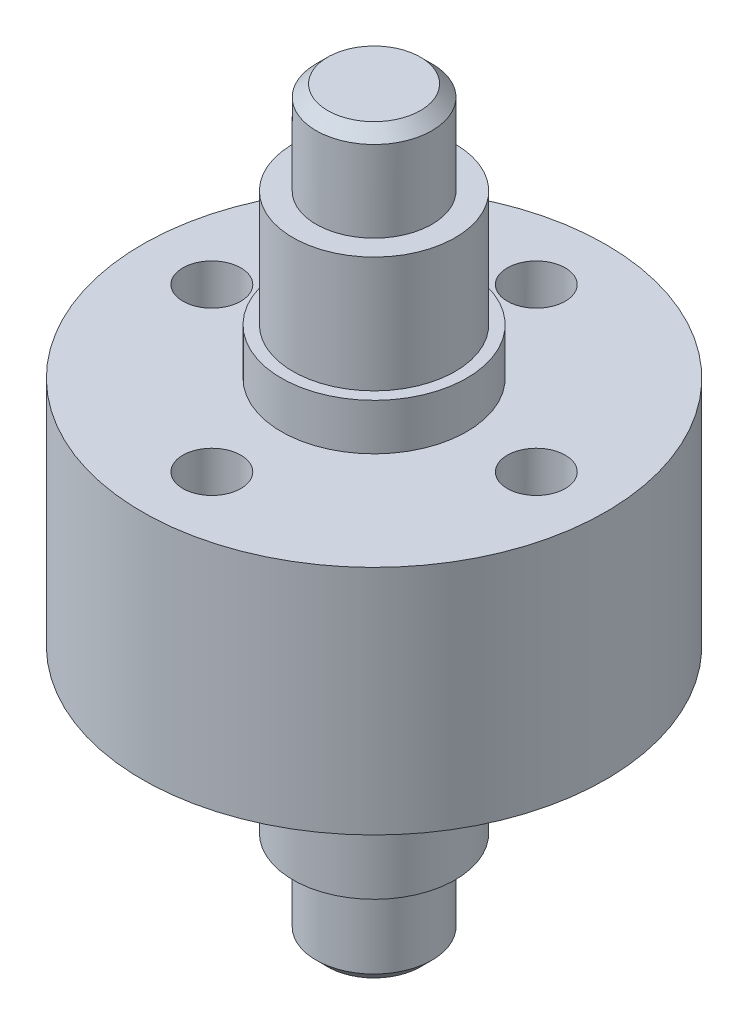
ISO-10303-21;
HEADER;
FILE_DESCRIPTION(('STEP AP214'),'2;1');
FILE_NAME('part.step','',(''),(''),'','','');
FILE_SCHEMA(('AUTOMOTIVE_DESIGN { 1 0 10303 214 1 1 1 1 }'));
ENDSEC;
DATA;
#1=APPLICATION_CONTEXT('core data for automotive mechanical design processes');
#2=APPLICATION_PROTOCOL_DEFINITION('international standard','automotive_design',2000,#1);
#3=PRODUCT_CONTEXT('',#1,'mechanical');
#4=PRODUCT('Part','Part','',(#3));
#5=PRODUCT_RELATED_PRODUCT_CATEGORY('part','',(#4));
#6=PRODUCT_DEFINITION_FORMATION('','',#4);
#7=PRODUCT_DEFINITION_CONTEXT('part definition',#1,'design');
#8=PRODUCT_DEFINITION('design','',#6,#7);
#9=PRODUCT_DEFINITION_SHAPE('','',#8);
#10=(LENGTH_UNIT() NAMED_UNIT(*) SI_UNIT(.MILLI.,.METRE.));
#11=(NAMED_UNIT(*) PLANE_ANGLE_UNIT() SI_UNIT($,.RADIAN.));
#12=(NAMED_UNIT(*) SI_UNIT($,.STERADIAN.) SOLID_ANGLE_UNIT());
#13=UNCERTAINTY_MEASURE_WITH_UNIT(LENGTH_MEASURE(1.E-05),#10,'distance_accuracy_value','');
#14=(GEOMETRIC_REPRESENTATION_CONTEXT(3) GLOBAL_UNCERTAINTY_ASSIGNED_CONTEXT((#13)) GLOBAL_UNIT_ASSIGNED_CONTEXT((#10,
#11,#12)) REPRESENTATION_CONTEXT('',''));
#15=CARTESIAN_POINT('',(0.,0.,0.));
#16=DIRECTION('',(0.,0.,1.));
#17=DIRECTION('',(1.,0.,0.));
#18=AXIS2_PLACEMENT_3D('',#15,#16,#17);
#19=CARTESIAN_POINT('',(2.5,0.,0.));
#20=DIRECTION('',(0.,-1.,0.));
#21=DIRECTION('',(0.,0.,-1.));
#22=AXIS2_PLACEMENT_3D('',#19,#20,#21);
#23=PLANE('',#22);
#24=CARTESIAN_POINT('',(0.,0.,0.));
#25=DIRECTION('',(0.,-1.,0.));
#26=DIRECTION('',(0.,0.,-1.));
#27=AXIS2_PLACEMENT_3D('',#24,#25,#26);
#28=CIRCLE('',#27,1.99999999999999);
#29=CARTESIAN_POINT('',(0.,0.,-1.99999999999999));
#30=VERTEX_POINT('',#29);
#31=EDGE_CURVE('E42',#30,#30,#28,.T.);
#32=ORIENTED_EDGE('',*,*,#31,.T.);
#33=EDGE_LOOP('',(#32));
#34=FACE_BOUND('',#33,.T.);
#35=ADVANCED_FACE('F35',(#34),#23,.T.);
#36=CARTESIAN_POINT('',(0.,32.,0.));
#37=DIRECTION('',(0.,1.,0.));
#38=DIRECTION('',(0.,0.,1.));
#39=AXIS2_PLACEMENT_3D('',#36,#37,#38);
#40=PLANE('',#39);
#41=CARTESIAN_POINT('',(0.,32.,0.));
#42=DIRECTION('',(0.,1.,0.));
#43=DIRECTION('',(0.,0.,1.));
#44=AXIS2_PLACEMENT_3D('',#41,#42,#43);
#45=CIRCLE('',#44,2.00000000000001);
#46=CARTESIAN_POINT('',(0.,32.,2.00000000000001));
#47=VERTEX_POINT('',#46);
#48=EDGE_CURVE('E46',#47,#47,#45,.T.);
#49=ORIENTED_EDGE('',*,*,#48,.T.);
#50=EDGE_LOOP('',(#49));
#51=FACE_BOUND('',#50,.T.);
#52=ADVANCED_FACE('F181',(#51),#40,.T.);
#53=CARTESIAN_POINT('',(0.,0.,0.));
#54=DIRECTION('',(0.,-1.,0.));
#55=DIRECTION('',(0.,0.,-1.));
#56=AXIS2_PLACEMENT_3D('',#53,#54,#55);
#57=CYLINDRICAL_SURFACE('',#56,2.5);
#58=CARTESIAN_POINT('',(0.,31.5,0.));
#59=DIRECTION('',(0.,1.,0.));
#60=DIRECTION('',(0.,0.,1.));
#61=AXIS2_PLACEMENT_3D('',#58,#59,#60);
#62=CIRCLE('',#61,2.5);
#63=CARTESIAN_POINT('',(0.,31.5,2.5));
#64=VERTEX_POINT('',#63);
#65=EDGE_CURVE('E50',#64,#64,#62,.F.);
#66=ORIENTED_EDGE('',*,*,#65,.T.);
#67=EDGE_LOOP('',(#66));
#68=FACE_BOUND('',#67,.T.);
#69=CARTESIAN_POINT('',(0.,28.,0.));
#70=DIRECTION('',(0.,-1.,0.));
#71=DIRECTION('',(0.,0.,-1.));
#72=AXIS2_PLACEMENT_3D('',#69,#70,#71);
#73=CIRCLE('',#72,2.5);
#74=CARTESIAN_POINT('',(0.,28.,-2.5));
#75=VERTEX_POINT('',#74);
#76=EDGE_CURVE('E55',#75,#75,#73,.T.);
#77=ORIENTED_EDGE('',*,*,#76,.F.);
#78=EDGE_LOOP('',(#77));
#79=FACE_BOUND('',#78,.T.);
#80=ADVANCED_FACE('F186',(#68,#79),#57,.T.);
#81=CARTESIAN_POINT('',(2.5,28.,0.));
#82=DIRECTION('',(0.,1.,0.));
#83=DIRECTION('',(0.,0.,1.));
#84=AXIS2_PLACEMENT_3D('',#81,#82,#83);
#85=PLANE('',#84);
#86=ORIENTED_EDGE('',*,*,#76,.T.);
#87=EDGE_LOOP('',(#86));
#88=FACE_BOUND('',#87,.T.);
#89=CARTESIAN_POINT('',(0.,28.,0.));
#90=DIRECTION('',(0.,-1.,0.));
#91=DIRECTION('',(0.,0.,-1.));
#92=AXIS2_PLACEMENT_3D('',#89,#90,#91);
#93=CIRCLE('',#92,3.5);
#94=CARTESIAN_POINT('',(0.,28.,-3.5));
#95=VERTEX_POINT('',#94);
#96=EDGE_CURVE('E63',#95,#95,#93,.T.);
#97=ORIENTED_EDGE('',*,*,#96,.F.);
#98=EDGE_LOOP('',(#97));
#99=FACE_BOUND('',#98,.T.);
#100=ADVANCED_FACE('F207',(#88,#99),#85,.T.);
#101=CARTESIAN_POINT('',(0.,0.,0.));
#102=DIRECTION('',(0.,-1.,0.));
#103=DIRECTION('',(0.,0.,-1.));
#104=AXIS2_PLACEMENT_3D('',#101,#102,#103);
#105=CYLINDRICAL_SURFACE('',#104,3.5);
#106=ORIENTED_EDGE('',*,*,#96,.T.);
#107=EDGE_LOOP('',(#106));
#108=FACE_BOUND('',#107,.T.);
#109=CARTESIAN_POINT('',(0.,23.,0.));
#110=DIRECTION('',(0.,-1.,0.));
#111=DIRECTION('',(0.,0.,-1.));
#112=AXIS2_PLACEMENT_3D('',#109,#110,#111);
#113=CIRCLE('',#112,3.5);
#114=CARTESIAN_POINT('',(0.,23.,-3.5));
#115=VERTEX_POINT('',#114);
#116=EDGE_CURVE('E66',#115,#115,#113,.T.);
#117=ORIENTED_EDGE('',*,*,#116,.F.);
#118=EDGE_LOOP('',(#117));
#119=FACE_BOUND('',#118,.T.);
#120=ADVANCED_FACE('F212',(#108,#119),#105,.T.);
#121=CARTESIAN_POINT('',(3.5,23.,0.));
#122=DIRECTION('',(0.,1.,0.));
#123=DIRECTION('',(0.,0.,1.));
#124=AXIS2_PLACEMENT_3D('',#121,#122,#123);
#125=PLANE('',#124);
#126=ORIENTED_EDGE('',*,*,#116,.T.);
#127=EDGE_LOOP('',(#126));
#128=FACE_BOUND('',#127,.T.);
#129=CARTESIAN_POINT('',(0.,23.,0.));
#130=DIRECTION('',(0.,-1.,0.));
#131=DIRECTION('',(0.,0.,-1.));
#132=AXIS2_PLACEMENT_3D('',#129,#130,#131);
#133=CIRCLE('',#132,4.);
#134=CARTESIAN_POINT('',(0.,23.,-4.));
#135=VERTEX_POINT('',#134);
#136=EDGE_CURVE('E69',#135,#135,#133,.T.);
#137=ORIENTED_EDGE('',*,*,#136,.F.);
#138=EDGE_LOOP('',(#137));
#139=FACE_BOUND('',#138,.T.);
#140=ADVANCED_FACE('F218',(#128,#139),#125,.T.);
#141=CARTESIAN_POINT('',(0.,0.,0.));
#142=DIRECTION('',(0.,-1.,0.));
#143=DIRECTION('',(0.,0.,-1.));
#144=AXIS2_PLACEMENT_3D('',#141,#142,#143);
#145=CYLINDRICAL_SURFACE('',#144,4.);
#146=ORIENTED_EDGE('',*,*,#136,.T.);
#147=EDGE_LOOP('',(#146));
#148=FACE_BOUND('',#147,.T.);
#149=CARTESIAN_POINT('',(0.,21.,0.));
#150=DIRECTION('',(0.,-1.,0.));
#151=DIRECTION('',(0.,0.,-1.));
#152=AXIS2_PLACEMENT_3D('',#149,#150,#151);
#153=CIRCLE('',#152,4.);
#154=CARTESIAN_POINT('',(0.,21.,-4.));
#155=VERTEX_POINT('',#154);
#156=EDGE_CURVE('E72',#155,#155,#153,.T.);
#157=ORIENTED_EDGE('',*,*,#156,.F.);
#158=EDGE_LOOP('',(#157));
#159=FACE_BOUND('',#158,.T.);
#160=ADVANCED_FACE('F122',(#148,#159),#145,.T.);
#161=CARTESIAN_POINT('',(4.,21.,0.));
#162=DIRECTION('',(0.,1.,0.));
#163=DIRECTION('',(0.,0.,1.));
#164=AXIS2_PLACEMENT_3D('',#161,#162,#163);
#165=PLANE('',#164);
#166=CARTESIAN_POINT('',(0.,21.,-7.));
#167=DIRECTION('',(0.,1.,0.));
#168=DIRECTION('',(0.,0.,1.));
#169=AXIS2_PLACEMENT_3D('',#166,#167,#168);
#170=CIRCLE('',#169,1.24999999999999);
#171=CARTESIAN_POINT('',(0.,21.,-5.75000000000001));
#172=VERTEX_POINT('',#171);
#173=EDGE_CURVE('E112',#172,#172,#170,.T.);
#174=ORIENTED_EDGE('',*,*,#173,.F.);
#175=EDGE_LOOP('',(#174));
#176=FACE_BOUND('',#175,.T.);
#177=CARTESIAN_POINT('',(7.,21.,0.));
#178=DIRECTION('',(0.,1.,0.));
#179=DIRECTION('',(0.,0.,1.));
#180=AXIS2_PLACEMENT_3D('',#177,#178,#179);
#181=CIRCLE('',#180,1.24999999999999);
#182=CARTESIAN_POINT('',(7.,21.,1.24999999999999));
#183=VERTEX_POINT('',#182);
#184=EDGE_CURVE('E106',#183,#183,#181,.T.);
#185=ORIENTED_EDGE('',*,*,#184,.F.);
#186=EDGE_LOOP('',(#185));
#187=FACE_BOUND('',#186,.T.);
#188=CARTESIAN_POINT('',(0.,21.,7.));
#189=DIRECTION('',(0.,1.,0.));
#190=DIRECTION('',(0.,0.,1.));
#191=AXIS2_PLACEMENT_3D('',#188,#189,#190);
#192=CIRCLE('',#191,1.24999999999999);
#193=CARTESIAN_POINT('',(0.,21.,8.24999999999999));
#194=VERTEX_POINT('',#193);
#195=EDGE_CURVE('E60',#194,#194,#192,.T.);
#196=ORIENTED_EDGE('',*,*,#195,.F.);
#197=EDGE_LOOP('',(#196));
#198=FACE_BOUND('',#197,.T.);
#199=CARTESIAN_POINT('',(-7.,21.,0.));
#200=DIRECTION('',(0.,1.,0.));
#201=DIRECTION('',(0.,0.,1.));
#202=AXIS2_PLACEMENT_3D('',#199,#200,#201);
#203=CIRCLE('',#202,1.24999999999999);
#204=CARTESIAN_POINT('',(-7.,21.,1.24999999999999));
#205=VERTEX_POINT('',#204);
#206=EDGE_CURVE('E59',#205,#205,#203,.T.);
#207=ORIENTED_EDGE('',*,*,#206,.F.);
#208=EDGE_LOOP('',(#207));
#209=FACE_BOUND('',#208,.T.);
#210=ORIENTED_EDGE('',*,*,#156,.T.);
#211=EDGE_LOOP('',(#210));
#212=FACE_BOUND('',#211,.T.);
#213=CARTESIAN_POINT('',(0.,21.,0.));
#214=DIRECTION('',(0.,-1.,0.));
#215=DIRECTION('',(0.,0.,-1.));
#216=AXIS2_PLACEMENT_3D('',#213,#214,#215);
#217=CIRCLE('',#216,10.);
#218=CARTESIAN_POINT('',(0.,21.,-10.));
#219=VERTEX_POINT('',#218);
#220=EDGE_CURVE('E75',#219,#219,#217,.T.);
#221=ORIENTED_EDGE('',*,*,#220,.F.);
#222=EDGE_LOOP('',(#221));
#223=FACE_BOUND('',#222,.T.);
#224=ADVANCED_FACE('F118',(#176,#187,#198,#209,#212,#223),#165,.T.);
#225=CARTESIAN_POINT('',(0.,0.,0.));
#226=DIRECTION('',(0.,-1.,0.));
#227=DIRECTION('',(0.,0.,-1.));
#228=AXIS2_PLACEMENT_3D('',#225,#226,#227);
#229=CYLINDRICAL_SURFACE('',#228,10.);
#230=ORIENTED_EDGE('',*,*,#220,.T.);
#231=EDGE_LOOP('',(#230));
#232=FACE_BOUND('',#231,.T.);
#233=CARTESIAN_POINT('',(0.,11.,0.));
#234=DIRECTION('',(0.,-1.,0.));
#235=DIRECTION('',(0.,0.,-1.));
#236=AXIS2_PLACEMENT_3D('',#233,#234,#235);
#237=CIRCLE('',#236,10.);
#238=CARTESIAN_POINT('',(0.,11.,-10.));
#239=VERTEX_POINT('',#238);
#240=EDGE_CURVE('E78',#239,#239,#237,.T.);
#241=ORIENTED_EDGE('',*,*,#240,.F.);
#242=EDGE_LOOP('',(#241));
#243=FACE_BOUND('',#242,.T.);
#244=ADVANCED_FACE('F121',(#232,#243),#229,.T.);
#245=CARTESIAN_POINT('',(10.,11.,0.));
#246=DIRECTION('',(0.,-1.,0.));
#247=DIRECTION('',(0.,0.,-1.));
#248=AXIS2_PLACEMENT_3D('',#245,#246,#247);
#249=PLANE('',#248);
#250=CARTESIAN_POINT('',(0.,11.,-7.));
#251=DIRECTION('',(0.,-1.,0.));
#252=DIRECTION('',(0.,0.,-1.));
#253=AXIS2_PLACEMENT_3D('',#250,#251,#252);
#254=CIRCLE('',#253,1.24999999999999);
#255=CARTESIAN_POINT('',(0.,11.,-8.24999999999999));
#256=VERTEX_POINT('',#255);
#257=EDGE_CURVE('E109',#256,#256,#254,.T.);
#258=ORIENTED_EDGE('',*,*,#257,.F.);
#259=EDGE_LOOP('',(#258));
#260=FACE_BOUND('',#259,.T.);
#261=CARTESIAN_POINT('',(7.,11.,0.));
#262=DIRECTION('',(0.,-1.,0.));
#263=DIRECTION('',(0.,0.,-1.));
#264=AXIS2_PLACEMENT_3D('',#261,#262,#263);
#265=CIRCLE('',#264,1.24999999999999);
#266=CARTESIAN_POINT('',(7.,11.,-1.24999999999999));
#267=VERTEX_POINT('',#266);
#268=EDGE_CURVE('E103',#267,#267,#265,.T.);
#269=ORIENTED_EDGE('',*,*,#268,.F.);
#270=EDGE_LOOP('',(#269));
#271=FACE_BOUND('',#270,.T.);
#272=CARTESIAN_POINT('',(0.,11.,7.));
#273=DIRECTION('',(0.,-1.,0.));
#274=DIRECTION('',(0.,0.,-1.));
#275=AXIS2_PLACEMENT_3D('',#272,#273,#274);
#276=CIRCLE('',#275,1.24999999999999);
#277=CARTESIAN_POINT('',(0.,11.,5.75000000000001));
#278=VERTEX_POINT('',#277);
#279=EDGE_CURVE('E56',#278,#278,#276,.T.);
#280=ORIENTED_EDGE('',*,*,#279,.F.);
#281=EDGE_LOOP('',(#280));
#282=FACE_BOUND('',#281,.T.);
#283=CARTESIAN_POINT('',(-7.,11.,0.));
#284=DIRECTION('',(0.,-1.,0.));
#285=DIRECTION('',(0.,0.,-1.));
#286=AXIS2_PLACEMENT_3D('',#283,#284,#285);
#287=CIRCLE('',#286,1.24999999999999);
#288=CARTESIAN_POINT('',(-7.,11.,-1.24999999999999));
#289=VERTEX_POINT('',#288);
#290=EDGE_CURVE('E96',#289,#289,#287,.T.);
#291=ORIENTED_EDGE('',*,*,#290,.F.);
#292=EDGE_LOOP('',(#291));
#293=FACE_BOUND('',#292,.T.);
#294=ORIENTED_EDGE('',*,*,#240,.T.);
#295=EDGE_LOOP('',(#294));
#296=FACE_BOUND('',#295,.T.);
#297=CARTESIAN_POINT('',(0.,11.,0.));
#298=DIRECTION('',(0.,-1.,0.));
#299=DIRECTION('',(0.,0.,-1.));
#300=AXIS2_PLACEMENT_3D('',#297,#298,#299);
#301=CIRCLE('',#300,4.);
#302=CARTESIAN_POINT('',(0.,11.,-4.));
#303=VERTEX_POINT('',#302);
#304=EDGE_CURVE('E81',#303,#303,#301,.T.);
#305=ORIENTED_EDGE('',*,*,#304,.F.);
#306=EDGE_LOOP('',(#305));
#307=FACE_BOUND('',#306,.T.);
#308=ADVANCED_FACE('F136',(#260,#271,#282,#293,#296,#307),#249,.T.);
#309=CARTESIAN_POINT('',(0.,0.,0.));
#310=DIRECTION('',(0.,-1.,0.));
#311=DIRECTION('',(0.,0.,-1.));
#312=AXIS2_PLACEMENT_3D('',#309,#310,#311);
#313=CYLINDRICAL_SURFACE('',#312,4.);
#314=ORIENTED_EDGE('',*,*,#304,.T.);
#315=EDGE_LOOP('',(#314));
#316=FACE_BOUND('',#315,.T.);
#317=CARTESIAN_POINT('',(0.,9.,0.));
#318=DIRECTION('',(0.,-1.,0.));
#319=DIRECTION('',(0.,0.,-1.));
#320=AXIS2_PLACEMENT_3D('',#317,#318,#319);
#321=CIRCLE('',#320,4.);
#322=CARTESIAN_POINT('',(0.,9.,-4.));
#323=VERTEX_POINT('',#322);
#324=EDGE_CURVE('E84',#323,#323,#321,.T.);
#325=ORIENTED_EDGE('',*,*,#324,.F.);
#326=EDGE_LOOP('',(#325));
#327=FACE_BOUND('',#326,.T.);
#328=ADVANCED_FACE('F142',(#316,#327),#313,.T.);
#329=CARTESIAN_POINT('',(4.,9.,0.));
#330=DIRECTION('',(0.,-1.,0.));
#331=DIRECTION('',(0.,0.,-1.));
#332=AXIS2_PLACEMENT_3D('',#329,#330,#331);
#333=PLANE('',#332);
#334=ORIENTED_EDGE('',*,*,#324,.T.);
#335=EDGE_LOOP('',(#334));
#336=FACE_BOUND('',#335,.T.);
#337=CARTESIAN_POINT('',(0.,9.,0.));
#338=DIRECTION('',(0.,-1.,0.));
#339=DIRECTION('',(0.,0.,-1.));
#340=AXIS2_PLACEMENT_3D('',#337,#338,#339);
#341=CIRCLE('',#340,3.5);
#342=CARTESIAN_POINT('',(0.,9.,-3.5));
#343=VERTEX_POINT('',#342);
#344=EDGE_CURVE('E87',#343,#343,#341,.T.);
#345=ORIENTED_EDGE('',*,*,#344,.F.);
#346=EDGE_LOOP('',(#345));
#347=FACE_BOUND('',#346,.T.);
#348=ADVANCED_FACE('F149',(#336,#347),#333,.T.);
#349=CARTESIAN_POINT('',(0.,0.,0.));
#350=DIRECTION('',(0.,-1.,0.));
#351=DIRECTION('',(0.,0.,-1.));
#352=AXIS2_PLACEMENT_3D('',#349,#350,#351);
#353=CYLINDRICAL_SURFACE('',#352,3.5);
#354=ORIENTED_EDGE('',*,*,#344,.T.);
#355=EDGE_LOOP('',(#354));
#356=FACE_BOUND('',#355,.T.);
#357=CARTESIAN_POINT('',(0.,4.,0.));
#358=DIRECTION('',(0.,-1.,0.));
#359=DIRECTION('',(0.,0.,-1.));
#360=AXIS2_PLACEMENT_3D('',#357,#358,#359);
#361=CIRCLE('',#360,3.5);
#362=CARTESIAN_POINT('',(0.,4.,-3.5));
#363=VERTEX_POINT('',#362);
#364=EDGE_CURVE('E90',#363,#363,#361,.T.);
#365=ORIENTED_EDGE('',*,*,#364,.F.);
#366=EDGE_LOOP('',(#365));
#367=FACE_BOUND('',#366,.T.);
#368=ADVANCED_FACE('F155',(#356,#367),#353,.T.);
#369=CARTESIAN_POINT('',(2.5,4.,0.));
#370=DIRECTION('',(0.,-1.,0.));
#371=DIRECTION('',(0.,0.,-1.));
#372=AXIS2_PLACEMENT_3D('',#369,#370,#371);
#373=PLANE('',#372);
#374=ORIENTED_EDGE('',*,*,#364,.T.);
#375=EDGE_LOOP('',(#374));
#376=FACE_BOUND('',#375,.T.);
#377=CARTESIAN_POINT('',(0.,4.,0.));
#378=DIRECTION('',(0.,-1.,0.));
#379=DIRECTION('',(0.,0.,-1.));
#380=AXIS2_PLACEMENT_3D('',#377,#378,#379);
#381=CIRCLE('',#380,2.5);
#382=CARTESIAN_POINT('',(0.,4.,-2.5));
#383=VERTEX_POINT('',#382);
#384=EDGE_CURVE('E93',#383,#383,#381,.T.);
#385=ORIENTED_EDGE('',*,*,#384,.F.);
#386=EDGE_LOOP('',(#385));
#387=FACE_BOUND('',#386,.T.);
#388=ADVANCED_FACE('F161',(#376,#387),#373,.T.);
#389=CARTESIAN_POINT('',(0.,0.,0.));
#390=DIRECTION('',(0.,-1.,0.));
#391=DIRECTION('',(0.,0.,-1.));
#392=AXIS2_PLACEMENT_3D('',#389,#390,#391);
#393=CYLINDRICAL_SURFACE('',#392,2.5);
#394=CARTESIAN_POINT('',(0.,0.5,0.));
#395=DIRECTION('',(0.,-1.,0.));
#396=DIRECTION('',(0.,0.,-1.));
#397=AXIS2_PLACEMENT_3D('',#394,#395,#396);
#398=CIRCLE('',#397,2.5);
#399=CARTESIAN_POINT('',(0.,0.5,-2.5));
#400=VERTEX_POINT('',#399);
#401=EDGE_CURVE('E10',#400,#400,#398,.F.);
#402=ORIENTED_EDGE('',*,*,#401,.T.);
#403=EDGE_LOOP('',(#402));
#404=FACE_BOUND('',#403,.T.);
#405=ORIENTED_EDGE('',*,*,#384,.T.);
#406=EDGE_LOOP('',(#405));
#407=FACE_BOUND('',#406,.T.);
#408=ADVANCED_FACE('F167',(#404,#407),#393,.T.);
#409=CARTESIAN_POINT('',(-7.,21.,0.));
#410=DIRECTION('',(0.,1.,0.));
#411=DIRECTION('',(0.,0.,1.));
#412=AXIS2_PLACEMENT_3D('',#409,#410,#411);
#413=CYLINDRICAL_SURFACE('',#412,1.24999999999999);
#414=ORIENTED_EDGE('',*,*,#290,.T.);
#415=EDGE_LOOP('',(#414));
#416=FACE_BOUND('',#415,.T.);
#417=ORIENTED_EDGE('',*,*,#206,.T.);
#418=EDGE_LOOP('',(#417));
#419=FACE_BOUND('',#418,.T.);
#420=ADVANCED_FACE('F172',(#416,#419),#413,.F.);
#421=CARTESIAN_POINT('',(0.,21.,7.));
#422=DIRECTION('',(0.,1.,0.));
#423=DIRECTION('',(0.,0.,1.));
#424=AXIS2_PLACEMENT_3D('',#421,#422,#423);
#425=CYLINDRICAL_SURFACE('',#424,1.24999999999999);
#426=ORIENTED_EDGE('',*,*,#279,.T.);
#427=EDGE_LOOP('',(#426));
#428=FACE_BOUND('',#427,.T.);
#429=ORIENTED_EDGE('',*,*,#195,.T.);
#430=EDGE_LOOP('',(#429));
#431=FACE_BOUND('',#430,.T.);
#432=ADVANCED_FACE('F177',(#428,#431),#425,.F.);
#433=CARTESIAN_POINT('',(7.,21.,0.));
#434=DIRECTION('',(0.,1.,0.));
#435=DIRECTION('',(0.,0.,1.));
#436=AXIS2_PLACEMENT_3D('',#433,#434,#435);
#437=CYLINDRICAL_SURFACE('',#436,1.24999999999999);
#438=ORIENTED_EDGE('',*,*,#268,.T.);
#439=EDGE_LOOP('',(#438));
#440=FACE_BOUND('',#439,.T.);
#441=ORIENTED_EDGE('',*,*,#184,.T.);
#442=EDGE_LOOP('',(#441));
#443=FACE_BOUND('',#442,.T.);
#444=ADVANCED_FACE('F198',(#440,#443),#437,.F.);
#445=CARTESIAN_POINT('',(0.,21.,-7.));
#446=DIRECTION('',(0.,1.,0.));
#447=DIRECTION('',(0.,0.,1.));
#448=AXIS2_PLACEMENT_3D('',#445,#446,#447);
#449=CYLINDRICAL_SURFACE('',#448,1.24999999999999);
#450=ORIENTED_EDGE('',*,*,#257,.T.);
#451=EDGE_LOOP('',(#450));
#452=FACE_BOUND('',#451,.T.);
#453=ORIENTED_EDGE('',*,*,#173,.T.);
#454=EDGE_LOOP('',(#453));
#455=FACE_BOUND('',#454,.T.);
#456=ADVANCED_FACE('F116',(#452,#455),#449,.F.);
#457=CARTESIAN_POINT('',(0.,31.5,0.));
#458=DIRECTION('',(0.,-1.,0.));
#459=DIRECTION('',(0.,0.,-1.));
#460=AXIS2_PLACEMENT_3D('',#457,#458,#459);
#461=CONICAL_SURFACE('',#460,2.5,0.785398163397447);
#462=ORIENTED_EDGE('',*,*,#48,.F.);
#463=EDGE_LOOP('',(#462));
#464=FACE_BOUND('',#463,.T.);
#465=ORIENTED_EDGE('',*,*,#65,.F.);
#466=EDGE_LOOP('',(#465));
#467=FACE_BOUND('',#466,.T.);
#468=ADVANCED_FACE('F190',(#464,#467),#461,.T.);
#469=CARTESIAN_POINT('',(0.,0.,0.));
#470=DIRECTION('',(0.,1.,0.));
#471=DIRECTION('',(0.,0.,1.));
#472=AXIS2_PLACEMENT_3D('',#469,#470,#471);
#473=CONICAL_SURFACE('',#472,1.99999999999999,0.785398163397453);
#474=ORIENTED_EDGE('',*,*,#401,.F.);
#475=EDGE_LOOP('',(#474));
#476=FACE_BOUND('',#475,.T.);
#477=ORIENTED_EDGE('',*,*,#31,.F.);
#478=EDGE_LOOP('',(#477));
#479=FACE_BOUND('',#478,.T.);
#480=ADVANCED_FACE('F37',(#476,#479),#473,.T.);
#481=CLOSED_SHELL('',(#35,#52,#80,#100,#120,#140,#160,#224,#244,#308,#328,#348,#368,#388,#408,
#420,#432,#444,#456,#468,#480));
#482=MANIFOLD_SOLID_BREP('B2',#481);
#483=ADVANCED_BREP_SHAPE_REPRESENTATION('',(#18,#482),#14);
#484=SHAPE_DEFINITION_REPRESENTATION(#9,#483);
ENDSEC;
END-ISO-10303-21;
